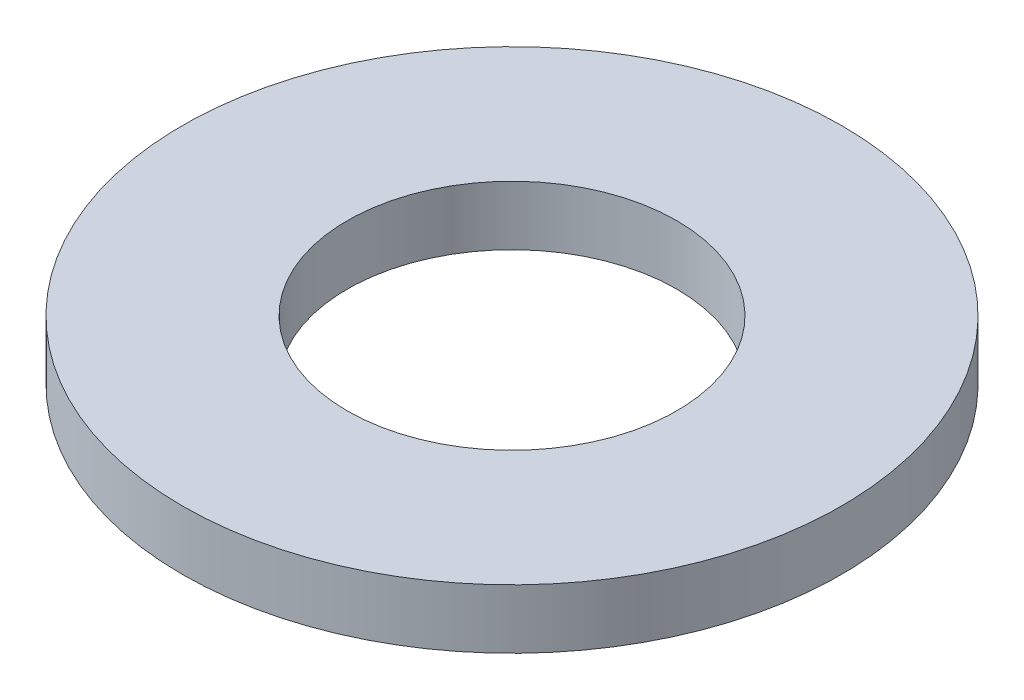
ISO-10303-21;
HEADER;
FILE_DESCRIPTION(('STEP AP214'),'2;1');
FILE_NAME('part.step','',(''),(''),'','','');
FILE_SCHEMA(('AUTOMOTIVE_DESIGN { 1 0 10303 214 1 1 1 1 }'));
ENDSEC;
DATA;
#1=APPLICATION_CONTEXT('core data for automotive mechanical design processes');
#2=APPLICATION_PROTOCOL_DEFINITION('international standard','automotive_design',2000,#1);
#3=PRODUCT_CONTEXT('',#1,'mechanical');
#4=PRODUCT('Part','Part','',(#3));
#5=PRODUCT_RELATED_PRODUCT_CATEGORY('part','',(#4));
#6=PRODUCT_DEFINITION_FORMATION('','',#4);
#7=PRODUCT_DEFINITION_CONTEXT('part definition',#1,'design');
#8=PRODUCT_DEFINITION('design','',#6,#7);
#9=PRODUCT_DEFINITION_SHAPE('','',#8);
#10=(LENGTH_UNIT() NAMED_UNIT(*) SI_UNIT(.MILLI.,.METRE.));
#11=(NAMED_UNIT(*) PLANE_ANGLE_UNIT() SI_UNIT($,.RADIAN.));
#12=(NAMED_UNIT(*) SI_UNIT($,.STERADIAN.) SOLID_ANGLE_UNIT());
#13=UNCERTAINTY_MEASURE_WITH_UNIT(LENGTH_MEASURE(1.E-05),#10,'distance_accuracy_value','');
#14=(GEOMETRIC_REPRESENTATION_CONTEXT(3) GLOBAL_UNCERTAINTY_ASSIGNED_CONTEXT((#13)) GLOBAL_UNIT_ASSIGNED_CONTEXT((#10,
#11,#12)) REPRESENTATION_CONTEXT('',''));
#15=CARTESIAN_POINT('',(0.,0.,0.));
#16=DIRECTION('',(0.,0.,1.));
#17=DIRECTION('',(1.,0.,0.));
#18=AXIS2_PLACEMENT_3D('',#15,#16,#17);
#19=CARTESIAN_POINT('',(0.,1.8,0.));
#20=DIRECTION('',(0.,1.,0.));
#21=DIRECTION('',(0.,0.,1.));
#22=AXIS2_PLACEMENT_3D('',#19,#20,#21);
#23=PLANE('',#22);
#24=CARTESIAN_POINT('',(0.,1.8,0.));
#25=DIRECTION('',(0.,1.,0.));
#26=DIRECTION('',(0.,0.,1.));
#27=AXIS2_PLACEMENT_3D('',#24,#25,#26);
#28=CIRCLE('',#27,10.);
#29=CARTESIAN_POINT('',(0.,1.8,10.));
#30=VERTEX_POINT('',#29);
#31=EDGE_CURVE('E10',#30,#30,#28,.T.);
#32=ORIENTED_EDGE('',*,*,#31,.T.);
#33=EDGE_LOOP('',(#32));
#34=FACE_BOUND('',#33,.T.);
#35=CARTESIAN_POINT('',(0.,1.8,0.));
#36=DIRECTION('',(0.,1.,0.));
#37=DIRECTION('',(0.,0.,1.));
#38=AXIS2_PLACEMENT_3D('',#35,#36,#37);
#39=CIRCLE('',#38,5.);
#40=CARTESIAN_POINT('',(0.,1.8,5.));
#41=VERTEX_POINT('',#40);
#42=EDGE_CURVE('E44',#41,#41,#39,.T.);
#43=ORIENTED_EDGE('',*,*,#42,.F.);
#44=EDGE_LOOP('',(#43));
#45=FACE_BOUND('',#44,.T.);
#46=ADVANCED_FACE('F33',(#34,#45),#23,.T.);
#47=CARTESIAN_POINT('',(0.,0.,0.));
#48=DIRECTION('',(0.,1.,0.));
#49=DIRECTION('',(0.,0.,1.));
#50=AXIS2_PLACEMENT_3D('',#47,#48,#49);
#51=PLANE('',#50);
#52=CARTESIAN_POINT('',(0.,0.,0.));
#53=DIRECTION('',(0.,1.,0.));
#54=DIRECTION('',(0.,0.,1.));
#55=AXIS2_PLACEMENT_3D('',#52,#53,#54);
#56=CIRCLE('',#55,10.);
#57=CARTESIAN_POINT('',(0.,0.,10.));
#58=VERTEX_POINT('',#57);
#59=EDGE_CURVE('E37',#58,#58,#56,.T.);
#60=ORIENTED_EDGE('',*,*,#59,.F.);
#61=EDGE_LOOP('',(#60));
#62=FACE_BOUND('',#61,.T.);
#63=CARTESIAN_POINT('',(0.,0.,0.));
#64=DIRECTION('',(0.,1.,0.));
#65=DIRECTION('',(0.,0.,1.));
#66=AXIS2_PLACEMENT_3D('',#63,#64,#65);
#67=CIRCLE('',#66,5.);
#68=CARTESIAN_POINT('',(0.,0.,5.));
#69=VERTEX_POINT('',#68);
#70=EDGE_CURVE('E46',#69,#69,#67,.T.);
#71=ORIENTED_EDGE('',*,*,#70,.T.);
#72=EDGE_LOOP('',(#71));
#73=FACE_BOUND('',#72,.T.);
#74=ADVANCED_FACE('F56',(#62,#73),#51,.F.);
#75=CARTESIAN_POINT('',(0.,1.8,0.));
#76=DIRECTION('',(0.,-1.,0.));
#77=DIRECTION('',(0.,0.,-1.));
#78=AXIS2_PLACEMENT_3D('',#75,#76,#77);
#79=CYLINDRICAL_SURFACE('',#78,10.);
#80=ORIENTED_EDGE('',*,*,#31,.F.);
#81=EDGE_LOOP('',(#80));
#82=FACE_BOUND('',#81,.T.);
#83=ORIENTED_EDGE('',*,*,#59,.T.);
#84=EDGE_LOOP('',(#83));
#85=FACE_BOUND('',#84,.T.);
#86=ADVANCED_FACE('F35',(#82,#85),#79,.T.);
#87=CARTESIAN_POINT('',(0.,1.8,0.));
#88=DIRECTION('',(0.,-1.,0.));
#89=DIRECTION('',(0.,0.,-1.));
#90=AXIS2_PLACEMENT_3D('',#87,#88,#89);
#91=CYLINDRICAL_SURFACE('',#90,5.);
#92=ORIENTED_EDGE('',*,*,#42,.T.);
#93=EDGE_LOOP('',(#92));
#94=FACE_BOUND('',#93,.T.);
#95=ORIENTED_EDGE('',*,*,#70,.F.);
#96=EDGE_LOOP('',(#95));
#97=FACE_BOUND('',#96,.T.);
#98=ADVANCED_FACE('F52',(#94,#97),#91,.F.);
#99=CLOSED_SHELL('',(#46,#74,#86,#98));
#100=MANIFOLD_SOLID_BREP('B2',#99);
#101=ADVANCED_BREP_SHAPE_REPRESENTATION('',(#18,#100),#14);
#102=SHAPE_DEFINITION_REPRESENTATION(#9,#101);
ENDSEC;
END-ISO-10303-21;
